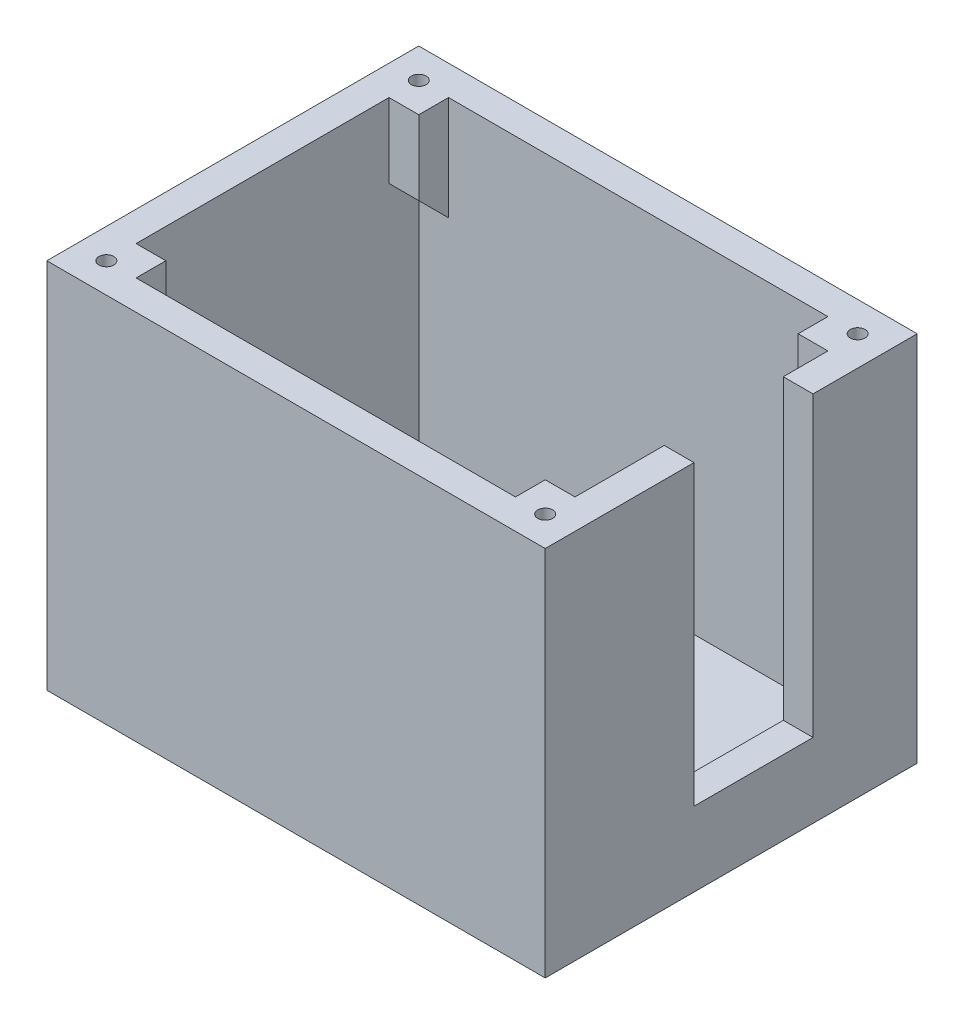
ISO-10303-21;
HEADER;
FILE_DESCRIPTION(('STEP AP214'),'2;1');
FILE_NAME('part.step','',(''),(''),'','','');
FILE_SCHEMA(('AUTOMOTIVE_DESIGN { 1 0 10303 214 1 1 1 1 }'));
ENDSEC;
DATA;
#1=APPLICATION_CONTEXT('core data for automotive mechanical design processes');
#2=APPLICATION_PROTOCOL_DEFINITION('international standard','automotive_design',2000,#1);
#3=PRODUCT_CONTEXT('',#1,'mechanical');
#4=PRODUCT('Part','Part','',(#3));
#5=PRODUCT_RELATED_PRODUCT_CATEGORY('part','',(#4));
#6=PRODUCT_DEFINITION_FORMATION('','',#4);
#7=PRODUCT_DEFINITION_CONTEXT('part definition',#1,'design');
#8=PRODUCT_DEFINITION('design','',#6,#7);
#9=PRODUCT_DEFINITION_SHAPE('','',#8);
#10=(LENGTH_UNIT() NAMED_UNIT(*) SI_UNIT(.MILLI.,.METRE.));
#11=(NAMED_UNIT(*) PLANE_ANGLE_UNIT() SI_UNIT($,.RADIAN.));
#12=(NAMED_UNIT(*) SI_UNIT($,.STERADIAN.) SOLID_ANGLE_UNIT());
#13=UNCERTAINTY_MEASURE_WITH_UNIT(LENGTH_MEASURE(1.E-05),#10,'distance_accuracy_value','');
#14=(GEOMETRIC_REPRESENTATION_CONTEXT(3) GLOBAL_UNCERTAINTY_ASSIGNED_CONTEXT((#13)) GLOBAL_UNIT_ASSIGNED_CONTEXT((#10,
#11,#12)) REPRESENTATION_CONTEXT('',''));
#15=CARTESIAN_POINT('',(0.,0.,0.));
#16=DIRECTION('',(0.,0.,1.));
#17=DIRECTION('',(1.,0.,0.));
#18=AXIS2_PLACEMENT_3D('',#15,#16,#17);
#19=CARTESIAN_POINT('',(-11.5454545454545,2.,0.));
#20=DIRECTION('',(-1.,0.,0.));
#21=DIRECTION('',(0.,0.,1.));
#22=AXIS2_PLACEMENT_3D('',#19,#20,#21);
#23=PLANE('',#22);
#24=DIRECTION('',(0.,0.,-1.));
#25=VECTOR('',#24,1.);
#26=CARTESIAN_POINT('',(-11.5454545454545,0.,0.));
#27=LINE('',#26,#25);
#28=CARTESIAN_POINT('',(-11.5454545454545,0.,6.56060606060606));
#29=VERTEX_POINT('',#28);
#30=CARTESIAN_POINT('',(-11.5454545454545,0.,-18.4393939393939));
#31=VERTEX_POINT('',#30);
#32=EDGE_CURVE('E396',#29,#31,#27,.T.);
#33=ORIENTED_EDGE('',*,*,#32,.F.);
#34=DIRECTION('',(0.,-1.,0.));
#35=VECTOR('',#34,1.);
#36=CARTESIAN_POINT('',(-11.5454545454545,2.,6.56060606060606));
#37=LINE('',#36,#35);
#38=CARTESIAN_POINT('',(-11.5454545454545,25.,6.56060606060606));
#39=VERTEX_POINT('',#38);
#40=EDGE_CURVE('E421',#39,#29,#37,.T.);
#41=ORIENTED_EDGE('',*,*,#40,.F.);
#42=DIRECTION('',(0.,0.,1.));
#43=VECTOR('',#42,1.);
#44=CARTESIAN_POINT('',(-11.5454545454545,25.,6.56060606060606));
#45=LINE('',#44,#43);
#46=CARTESIAN_POINT('',(-11.5454545454545,25.,-18.4393939393939));
#47=VERTEX_POINT('',#46);
#48=EDGE_CURVE('E362',#47,#39,#45,.T.);
#49=ORIENTED_EDGE('',*,*,#48,.F.);
#50=DIRECTION('',(0.,-1.,0.));
#51=VECTOR('',#50,1.);
#52=CARTESIAN_POINT('',(-11.5454545454545,2.,-18.4393939393939));
#53=LINE('',#52,#51);
#54=EDGE_CURVE('E411',#47,#31,#53,.T.);
#55=ORIENTED_EDGE('',*,*,#54,.T.);
#56=EDGE_LOOP('',(#33,#41,#49,#55));
#57=FACE_BOUND('',#56,.T.);
#58=ADVANCED_FACE('F48',(#57),#23,.T.);
#59=CARTESIAN_POINT('',(0.,2.,6.56060606060606));
#60=DIRECTION('',(0.,0.,-1.));
#61=DIRECTION('',(-1.,0.,0.));
#62=AXIS2_PLACEMENT_3D('',#59,#60,#61);
#63=PLANE('',#62);
#64=DIRECTION('',(1.,0.,0.));
#65=VECTOR('',#64,1.);
#66=CARTESIAN_POINT('',(0.,0.,6.56060606060606));
#67=LINE('',#66,#65);
#68=CARTESIAN_POINT('',(21.9545454545455,0.,6.56060606060606));
#69=VERTEX_POINT('',#68);
#70=EDGE_CURVE('E400',#29,#69,#67,.T.);
#71=ORIENTED_EDGE('',*,*,#70,.T.);
#72=DIRECTION('',(0.,-1.,0.));
#73=VECTOR('',#72,1.);
#74=CARTESIAN_POINT('',(21.9545454545455,2.,6.56060606060606));
#75=LINE('',#74,#73);
#76=CARTESIAN_POINT('',(21.9545454545455,25.,6.56060606060606));
#77=VERTEX_POINT('',#76);
#78=EDGE_CURVE('E417',#77,#69,#75,.T.);
#79=ORIENTED_EDGE('',*,*,#78,.F.);
#80=DIRECTION('',(1.,0.,0.));
#81=VECTOR('',#80,1.);
#82=CARTESIAN_POINT('',(-11.5454545454545,25.,6.56060606060606));
#83=LINE('',#82,#81);
#84=EDGE_CURVE('E358',#39,#77,#83,.T.);
#85=ORIENTED_EDGE('',*,*,#84,.F.);
#86=ORIENTED_EDGE('',*,*,#40,.T.);
#87=EDGE_LOOP('',(#71,#79,#85,#86));
#88=FACE_BOUND('',#87,.T.);
#89=ADVANCED_FACE('F482',(#88),#63,.F.);
#90=CARTESIAN_POINT('',(21.9545454545455,2.,0.));
#91=DIRECTION('',(-1.,0.,0.));
#92=DIRECTION('',(0.,0.,1.));
#93=AXIS2_PLACEMENT_3D('',#90,#91,#92);
#94=PLANE('',#93);
#95=DIRECTION('',(0.,0.,-1.));
#96=VECTOR('',#95,1.);
#97=CARTESIAN_POINT('',(21.9545454545455,25.,6.56060606060606));
#98=LINE('',#97,#96);
#99=CARTESIAN_POINT('',(21.9545454545455,25.,-11.4393939393939));
#100=VERTEX_POINT('',#99);
#101=CARTESIAN_POINT('',(21.9545454545455,25.,-18.4393939393939));
#102=VERTEX_POINT('',#101);
#103=EDGE_CURVE('E353',#100,#102,#98,.T.);
#104=ORIENTED_EDGE('',*,*,#103,.F.);
#105=DIRECTION('',(0.,1.,0.));
#106=VECTOR('',#105,1.);
#107=CARTESIAN_POINT('',(21.9545454545455,-6.24621125123532,-11.4393939393939));
#108=LINE('',#107,#106);
#109=CARTESIAN_POINT('',(21.9545454545455,5.,-11.4393939393939));
#110=VERTEX_POINT('',#109);
#111=EDGE_CURVE('E327',#110,#100,#108,.T.);
#112=ORIENTED_EDGE('',*,*,#111,.F.);
#113=DIRECTION('',(0.,0.,1.));
#114=VECTOR('',#113,1.);
#115=CARTESIAN_POINT('',(21.9545454545455,5.,-3.43939393939394));
#116=LINE('',#115,#114);
#117=CARTESIAN_POINT('',(21.9545454545455,5.,-3.43939393939394));
#118=VERTEX_POINT('',#117);
#119=EDGE_CURVE('E305',#110,#118,#116,.T.);
#120=ORIENTED_EDGE('',*,*,#119,.T.);
#121=DIRECTION('',(0.,1.,0.));
#122=VECTOR('',#121,1.);
#123=CARTESIAN_POINT('',(21.9545454545455,-6.24621125123532,-3.43939393939394));
#124=LINE('',#123,#122);
#125=CARTESIAN_POINT('',(21.9545454545455,25.,-3.43939393939394));
#126=VERTEX_POINT('',#125);
#127=EDGE_CURVE('E330',#118,#126,#124,.T.);
#128=ORIENTED_EDGE('',*,*,#127,.T.);
#129=EDGE_CURVE('E354',#77,#126,#98,.T.);
#130=ORIENTED_EDGE('',*,*,#129,.F.);
#131=ORIENTED_EDGE('',*,*,#78,.T.);
#132=DIRECTION('',(0.,0.,-1.));
#133=VECTOR('',#132,1.);
#134=CARTESIAN_POINT('',(21.9545454545455,0.,0.));
#135=LINE('',#134,#133);
#136=CARTESIAN_POINT('',(21.9545454545455,0.,-18.4393939393939));
#137=VERTEX_POINT('',#136);
#138=EDGE_CURVE('E403',#69,#137,#135,.T.);
#139=ORIENTED_EDGE('',*,*,#138,.T.);
#140=DIRECTION('',(0.,-1.,0.));
#141=VECTOR('',#140,1.);
#142=CARTESIAN_POINT('',(21.9545454545455,2.,-18.4393939393939));
#143=LINE('',#142,#141);
#144=EDGE_CURVE('E414',#102,#137,#143,.T.);
#145=ORIENTED_EDGE('',*,*,#144,.F.);
#146=EDGE_LOOP('',(#104,#112,#120,#128,#130,#131,#139,#145));
#147=FACE_BOUND('',#146,.T.);
#148=ADVANCED_FACE('F470',(#147),#94,.F.);
#149=CARTESIAN_POINT('',(0.,2.,-18.4393939393939));
#150=DIRECTION('',(0.,0.,-1.));
#151=DIRECTION('',(-1.,0.,0.));
#152=AXIS2_PLACEMENT_3D('',#149,#150,#151);
#153=PLANE('',#152);
#154=DIRECTION('',(1.,0.,0.));
#155=VECTOR('',#154,1.);
#156=CARTESIAN_POINT('',(0.,0.,-18.4393939393939));
#157=LINE('',#156,#155);
#158=EDGE_CURVE('E407',#31,#137,#157,.T.);
#159=ORIENTED_EDGE('',*,*,#158,.F.);
#160=ORIENTED_EDGE('',*,*,#54,.F.);
#161=DIRECTION('',(-1.,0.,0.));
#162=VECTOR('',#161,1.);
#163=CARTESIAN_POINT('',(-11.5454545454545,25.,-18.4393939393939));
#164=LINE('',#163,#162);
#165=EDGE_CURVE('E349',#102,#47,#164,.T.);
#166=ORIENTED_EDGE('',*,*,#165,.F.);
#167=ORIENTED_EDGE('',*,*,#144,.T.);
#168=EDGE_LOOP('',(#159,#160,#166,#167));
#169=FACE_BOUND('',#168,.T.);
#170=ADVANCED_FACE('F475',(#169),#153,.T.);
#171=CARTESIAN_POINT('',(0.,0.,0.));
#172=DIRECTION('',(0.,1.,0.));
#173=DIRECTION('',(0.,0.,1.));
#174=AXIS2_PLACEMENT_3D('',#171,#172,#173);
#175=PLANE('',#174);
#176=ORIENTED_EDGE('',*,*,#32,.T.);
#177=ORIENTED_EDGE('',*,*,#158,.T.);
#178=ORIENTED_EDGE('',*,*,#138,.F.);
#179=ORIENTED_EDGE('',*,*,#70,.F.);
#180=EDGE_LOOP('',(#176,#177,#178,#179));
#181=FACE_BOUND('',#180,.T.);
#182=ADVANCED_FACE('F601',(#181),#175,.F.);
#183=CARTESIAN_POINT('',(-9.54545454545454,89.8001196170537,-16.4393939393939));
#184=DIRECTION('',(0.,0.,1.));
#185=DIRECTION('',(1.,0.,0.));
#186=AXIS2_PLACEMENT_3D('',#183,#184,#185);
#187=PLANE('',#186);
#188=DIRECTION('',(0.,-1.,0.));
#189=VECTOR('',#188,1.);
#190=CARTESIAN_POINT('',(19.9545454545455,89.8001196170537,-16.4393939393939));
#191=LINE('',#190,#189);
#192=CARTESIAN_POINT('',(19.9545454545455,18.,-16.4393939393939));
#193=VERTEX_POINT('',#192);
#194=CARTESIAN_POINT('',(19.9545454545455,2.,-16.4393939393939));
#195=VERTEX_POINT('',#194);
#196=EDGE_CURVE('E369',#193,#195,#191,.T.);
#197=ORIENTED_EDGE('',*,*,#196,.F.);
#198=DIRECTION('',(-1.,0.,0.));
#199=VECTOR('',#198,1.);
#200=CARTESIAN_POINT('',(17.9545454545455,18.,-16.4393939393939));
#201=LINE('',#200,#199);
#202=CARTESIAN_POINT('',(17.9545454545455,18.,-16.4393939393939));
#203=VERTEX_POINT('',#202);
#204=EDGE_CURVE('E447',#193,#203,#201,.T.);
#205=ORIENTED_EDGE('',*,*,#204,.T.);
#206=DIRECTION('',(0.,1.,0.));
#207=VECTOR('',#206,1.);
#208=CARTESIAN_POINT('',(17.9545454545455,20.,-16.4393939393939));
#209=LINE('',#208,#207);
#210=CARTESIAN_POINT('',(17.9545454545455,25.,-16.4393939393939));
#211=VERTEX_POINT('',#210);
#212=EDGE_CURVE('E65',#203,#211,#209,.T.);
#213=ORIENTED_EDGE('',*,*,#212,.T.);
#214=DIRECTION('',(-1.,0.,0.));
#215=VECTOR('',#214,1.);
#216=CARTESIAN_POINT('',(-9.54545454545454,25.,-16.4393939393939));
#217=LINE('',#216,#215);
#218=CARTESIAN_POINT('',(-7.54545454545454,25.,-16.4393939393939));
#219=VERTEX_POINT('',#218);
#220=EDGE_CURVE('E228',#211,#219,#217,.T.);
#221=ORIENTED_EDGE('',*,*,#220,.T.);
#222=DIRECTION('',(0.,1.,0.));
#223=VECTOR('',#222,1.);
#224=CARTESIAN_POINT('',(-7.54545454545454,20.,-16.4393939393939));
#225=LINE('',#224,#223);
#226=CARTESIAN_POINT('',(-7.54545454545454,18.,-16.4393939393939));
#227=VERTEX_POINT('',#226);
#228=EDGE_CURVE('E73',#227,#219,#225,.T.);
#229=ORIENTED_EDGE('',*,*,#228,.F.);
#230=DIRECTION('',(-1.,0.,0.));
#231=VECTOR('',#230,1.);
#232=CARTESIAN_POINT('',(-9.54545454545454,18.,-16.4393939393939));
#233=LINE('',#232,#231);
#234=CARTESIAN_POINT('',(-9.54545454545454,18.,-16.4393939393939));
#235=VERTEX_POINT('',#234);
#236=EDGE_CURVE('E444',#227,#235,#233,.T.);
#237=ORIENTED_EDGE('',*,*,#236,.T.);
#238=DIRECTION('',(0.,-1.,0.));
#239=VECTOR('',#238,1.);
#240=CARTESIAN_POINT('',(-9.54545454545454,89.8001196170537,-16.4393939393939));
#241=LINE('',#240,#239);
#242=CARTESIAN_POINT('',(-9.54545454545454,2.00000000000003,-16.4393939393939));
#243=VERTEX_POINT('',#242);
#244=EDGE_CURVE('E366',#235,#243,#241,.T.);
#245=ORIENTED_EDGE('',*,*,#244,.T.);
#246=DIRECTION('',(1.,0.,0.));
#247=VECTOR('',#246,1.);
#248=CARTESIAN_POINT('',(0.,2.,-16.4393939393939));
#249=LINE('',#248,#247);
#250=EDGE_CURVE('E392',#243,#195,#249,.T.);
#251=ORIENTED_EDGE('',*,*,#250,.T.);
#252=EDGE_LOOP('',(#197,#205,#213,#221,#229,#237,#245,#251));
#253=FACE_BOUND('',#252,.T.);
#254=ADVANCED_FACE('F529',(#253),#187,.T.);
#255=CARTESIAN_POINT('',(19.9545454545455,89.8001196170537,4.56060606060606));
#256=DIRECTION('',(-1.,0.,0.));
#257=DIRECTION('',(0.,0.,1.));
#258=AXIS2_PLACEMENT_3D('',#255,#256,#257);
#259=PLANE('',#258);
#260=DIRECTION('',(0.,-1.,0.));
#261=VECTOR('',#260,1.);
#262=CARTESIAN_POINT('',(19.9545454545455,89.8001196170537,4.56060606060606));
#263=LINE('',#262,#261);
#264=CARTESIAN_POINT('',(19.9545454545455,18.,4.56060606060606));
#265=VERTEX_POINT('',#264);
#266=CARTESIAN_POINT('',(19.9545454545455,2.,4.56060606060606));
#267=VERTEX_POINT('',#266);
#268=EDGE_CURVE('E372',#265,#267,#263,.T.);
#269=ORIENTED_EDGE('',*,*,#268,.F.);
#270=DIRECTION('',(0.,0.707106781186552,-0.707106781186543));
#271=VECTOR('',#270,1.);
#272=CARTESIAN_POINT('',(19.9545454545455,53.9000598085273,-31.3394537479208));
#273=LINE('',#272,#271);
#274=CARTESIAN_POINT('',(19.9545454545455,20.,2.56060606060606));
#275=VERTEX_POINT('',#274);
#276=EDGE_CURVE('E435',#265,#275,#273,.T.);
#277=ORIENTED_EDGE('',*,*,#276,.T.);
#278=DIRECTION('',(0.,1.,0.));
#279=VECTOR('',#278,1.);
#280=CARTESIAN_POINT('',(19.9545454545455,20.,2.56060606060606));
#281=LINE('',#280,#279);
#282=CARTESIAN_POINT('',(19.9545454545455,25.,2.56060606060606));
#283=VERTEX_POINT('',#282);
#284=EDGE_CURVE('E241',#275,#283,#281,.T.);
#285=ORIENTED_EDGE('',*,*,#284,.T.);
#286=DIRECTION('',(0.,0.,-1.));
#287=VECTOR('',#286,1.);
#288=CARTESIAN_POINT('',(19.9545454545455,25.,4.56060606060606));
#289=LINE('',#288,#287);
#290=CARTESIAN_POINT('',(19.9545454545455,25.,-3.43939393939394));
#291=VERTEX_POINT('',#290);
#292=EDGE_CURVE('E340',#283,#291,#289,.T.);
#293=ORIENTED_EDGE('',*,*,#292,.T.);
#294=DIRECTION('',(0.,1.,0.));
#295=VECTOR('',#294,1.);
#296=CARTESIAN_POINT('',(19.9545454545455,-6.24621125123532,-3.43939393939394));
#297=LINE('',#296,#295);
#298=CARTESIAN_POINT('',(19.9545454545455,5.,-3.43939393939394));
#299=VERTEX_POINT('',#298);
#300=EDGE_CURVE('E323',#299,#291,#297,.T.);
#301=ORIENTED_EDGE('',*,*,#300,.F.);
#302=DIRECTION('',(0.,0.,-1.));
#303=VECTOR('',#302,1.);
#304=CARTESIAN_POINT('',(19.9545454545455,5.,-3.43939393939394));
#305=LINE('',#304,#303);
#306=CARTESIAN_POINT('',(19.9545454545455,5.,-11.4393939393939));
#307=VERTEX_POINT('',#306);
#308=EDGE_CURVE('E313',#299,#307,#305,.T.);
#309=ORIENTED_EDGE('',*,*,#308,.T.);
#310=DIRECTION('',(0.,1.,0.));
#311=VECTOR('',#310,1.);
#312=CARTESIAN_POINT('',(19.9545454545455,-6.24621125123532,-11.4393939393939));
#313=LINE('',#312,#311);
#314=CARTESIAN_POINT('',(19.9545454545455,25.,-11.4393939393939));
#315=VERTEX_POINT('',#314);
#316=EDGE_CURVE('E310',#307,#315,#313,.T.);
#317=ORIENTED_EDGE('',*,*,#316,.T.);
#318=CARTESIAN_POINT('',(19.9545454545455,25.,-14.4393939393939));
#319=VERTEX_POINT('',#318);
#320=EDGE_CURVE('E339',#315,#319,#289,.T.);
#321=ORIENTED_EDGE('',*,*,#320,.T.);
#322=DIRECTION('',(0.,1.,0.));
#323=VECTOR('',#322,1.);
#324=CARTESIAN_POINT('',(19.9545454545455,20.,-14.4393939393939));
#325=LINE('',#324,#323);
#326=CARTESIAN_POINT('',(19.9545454545455,20.,-14.4393939393939));
#327=VERTEX_POINT('',#326);
#328=EDGE_CURVE('E219',#327,#319,#325,.T.);
#329=ORIENTED_EDGE('',*,*,#328,.F.);
#330=DIRECTION('',(0.,0.707106781186552,0.707106781186543));
#331=VECTOR('',#330,1.);
#332=CARTESIAN_POINT('',(19.9545454545455,64.4000598085273,29.9606658691328));
#333=LINE('',#332,#331);
#334=EDGE_CURVE('E432',#327,#193,#333,.F.);
#335=ORIENTED_EDGE('',*,*,#334,.T.);
#336=ORIENTED_EDGE('',*,*,#196,.T.);
#337=DIRECTION('',(0.,0.,1.));
#338=VECTOR('',#337,1.);
#339=CARTESIAN_POINT('',(19.9545454545455,2.,0.));
#340=LINE('',#339,#338);
#341=EDGE_CURVE('E388',#195,#267,#340,.T.);
#342=ORIENTED_EDGE('',*,*,#341,.T.);
#343=EDGE_LOOP('',(#269,#277,#285,#293,#301,#309,#317,#321,#329,#335,#336,#342));
#344=FACE_BOUND('',#343,.T.);
#345=ADVANCED_FACE('F462',(#344),#259,.T.);
#346=CARTESIAN_POINT('',(-9.54545454545454,89.8001196170537,4.56060606060606));
#347=DIRECTION('',(0.,0.,-1.));
#348=DIRECTION('',(-1.,0.,0.));
#349=AXIS2_PLACEMENT_3D('',#346,#347,#348);
#350=PLANE('',#349);
#351=DIRECTION('',(0.,1.,0.));
#352=VECTOR('',#351,1.);
#353=CARTESIAN_POINT('',(17.9545454545455,20.,4.56060606060606));
#354=LINE('',#353,#352);
#355=CARTESIAN_POINT('',(17.9545454545455,18.,4.56060606060606));
#356=VERTEX_POINT('',#355);
#357=CARTESIAN_POINT('',(17.9545454545455,25.,4.56060606060606));
#358=VERTEX_POINT('',#357);
#359=EDGE_CURVE('E230',#356,#358,#354,.T.);
#360=ORIENTED_EDGE('',*,*,#359,.F.);
#361=DIRECTION('',(1.,0.,0.));
#362=VECTOR('',#361,1.);
#363=CARTESIAN_POINT('',(-9.54545454545454,18.,4.56060606060606));
#364=LINE('',#363,#362);
#365=EDGE_CURVE('E428',#356,#265,#364,.T.);
#366=ORIENTED_EDGE('',*,*,#365,.T.);
#367=ORIENTED_EDGE('',*,*,#268,.T.);
#368=DIRECTION('',(-1.,0.,0.));
#369=VECTOR('',#368,1.);
#370=CARTESIAN_POINT('',(0.,2.,4.56060606060606));
#371=LINE('',#370,#369);
#372=CARTESIAN_POINT('',(-9.54545454545454,2.,4.56060606060606));
#373=VERTEX_POINT('',#372);
#374=EDGE_CURVE('E384',#267,#373,#371,.T.);
#375=ORIENTED_EDGE('',*,*,#374,.T.);
#376=DIRECTION('',(0.,-1.,0.));
#377=VECTOR('',#376,1.);
#378=CARTESIAN_POINT('',(-9.54545454545454,89.8001196170537,4.56060606060606));
#379=LINE('',#378,#377);
#380=CARTESIAN_POINT('',(-9.54545454545454,18.,4.56060606060606));
#381=VERTEX_POINT('',#380);
#382=EDGE_CURVE('E375',#381,#373,#379,.T.);
#383=ORIENTED_EDGE('',*,*,#382,.F.);
#384=DIRECTION('',(1.,0.,0.));
#385=VECTOR('',#384,1.);
#386=CARTESIAN_POINT('',(-7.54545454545454,18.,4.56060606060606));
#387=LINE('',#386,#385);
#388=CARTESIAN_POINT('',(-7.54545454545454,18.,4.56060606060606));
#389=VERTEX_POINT('',#388);
#390=EDGE_CURVE('E424',#381,#389,#387,.T.);
#391=ORIENTED_EDGE('',*,*,#390,.T.);
#392=DIRECTION('',(0.,1.,0.));
#393=VECTOR('',#392,1.);
#394=CARTESIAN_POINT('',(-7.54545454545454,20.,4.56060606060606));
#395=LINE('',#394,#393);
#396=CARTESIAN_POINT('',(-7.54545454545454,25.,4.56060606060606));
#397=VERTEX_POINT('',#396);
#398=EDGE_CURVE('E263',#389,#397,#395,.T.);
#399=ORIENTED_EDGE('',*,*,#398,.T.);
#400=DIRECTION('',(1.,0.,0.));
#401=VECTOR('',#400,1.);
#402=CARTESIAN_POINT('',(-9.54545454545454,25.,4.56060606060606));
#403=LINE('',#402,#401);
#404=EDGE_CURVE('E343',#397,#358,#403,.T.);
#405=ORIENTED_EDGE('',*,*,#404,.T.);
#406=EDGE_LOOP('',(#360,#366,#367,#375,#383,#391,#399,#405));
#407=FACE_BOUND('',#406,.T.);
#408=ADVANCED_FACE('F505',(#407),#350,.T.);
#409=CARTESIAN_POINT('',(-9.54545454545454,89.8001196170537,4.56060606060606));
#410=DIRECTION('',(1.,0.,0.));
#411=DIRECTION('',(0.,0.,-1.));
#412=AXIS2_PLACEMENT_3D('',#409,#410,#411);
#413=PLANE('',#412);
#414=DIRECTION('',(0.,1.,0.));
#415=VECTOR('',#414,1.);
#416=CARTESIAN_POINT('',(-9.54545454545454,20.,2.56060606060606));
#417=LINE('',#416,#415);
#418=CARTESIAN_POINT('',(-9.54545454545454,20.,2.56060606060606));
#419=VERTEX_POINT('',#418);
#420=CARTESIAN_POINT('',(-9.54545454545454,25.,2.56060606060606));
#421=VERTEX_POINT('',#420);
#422=EDGE_CURVE('E259',#419,#421,#417,.T.);
#423=ORIENTED_EDGE('',*,*,#422,.F.);
#424=DIRECTION('',(0.,0.707106781186552,-0.707106781186543));
#425=VECTOR('',#424,1.);
#426=CARTESIAN_POINT('',(-9.54545454545454,53.9000598085273,-31.3394537479208));
#427=LINE('',#426,#425);
#428=EDGE_CURVE('E441',#419,#381,#427,.F.);
#429=ORIENTED_EDGE('',*,*,#428,.T.);
#430=ORIENTED_EDGE('',*,*,#382,.T.);
#431=DIRECTION('',(0.,0.,-1.));
#432=VECTOR('',#431,1.);
#433=CARTESIAN_POINT('',(-9.54545454545454,2.,0.));
#434=LINE('',#433,#432);
#435=EDGE_CURVE('E380',#373,#243,#434,.T.);
#436=ORIENTED_EDGE('',*,*,#435,.T.);
#437=ORIENTED_EDGE('',*,*,#244,.F.);
#438=DIRECTION('',(0.,0.707106781186552,0.707106781186543));
#439=VECTOR('',#438,1.);
#440=CARTESIAN_POINT('',(-9.54545454545454,64.4000598085273,29.9606658691328));
#441=LINE('',#440,#439);
#442=CARTESIAN_POINT('',(-9.54545454545454,20.,-14.4393939393939));
#443=VERTEX_POINT('',#442);
#444=EDGE_CURVE('E438',#235,#443,#441,.T.);
#445=ORIENTED_EDGE('',*,*,#444,.T.);
#446=DIRECTION('',(0.,1.,0.));
#447=VECTOR('',#446,1.);
#448=CARTESIAN_POINT('',(-9.54545454545454,20.,-14.4393939393939));
#449=LINE('',#448,#447);
#450=CARTESIAN_POINT('',(-9.54545454545454,25.,-14.4393939393939));
#451=VERTEX_POINT('',#450);
#452=EDGE_CURVE('E290',#443,#451,#449,.T.);
#453=ORIENTED_EDGE('',*,*,#452,.T.);
#454=DIRECTION('',(0.,0.,1.));
#455=VECTOR('',#454,1.);
#456=CARTESIAN_POINT('',(-9.54545454545454,25.,4.56060606060606));
#457=LINE('',#456,#455);
#458=EDGE_CURVE('E346',#451,#421,#457,.T.);
#459=ORIENTED_EDGE('',*,*,#458,.T.);
#460=EDGE_LOOP('',(#423,#429,#430,#436,#437,#445,#453,#459));
#461=FACE_BOUND('',#460,.T.);
#462=ADVANCED_FACE('F519',(#461),#413,.T.);
#463=CARTESIAN_POINT('',(0.,25.,0.));
#464=DIRECTION('',(0.,1.,0.));
#465=DIRECTION('',(0.,0.,1.));
#466=AXIS2_PLACEMENT_3D('',#463,#464,#465);
#467=PLANE('',#466);
#468=CARTESIAN_POINT('',(-9.54545454545454,25.,4.56060606060606));
#469=DIRECTION('',(0.,1.,0.));
#470=DIRECTION('',(0.,0.,1.));
#471=AXIS2_PLACEMENT_3D('',#468,#469,#470);
#472=CIRCLE('',#471,0.500000000000001);
#473=CARTESIAN_POINT('',(-9.54545454545454,25.,5.06060606060606));
#474=VERTEX_POINT('',#473);
#475=EDGE_CURVE('E949',#474,#474,#472,.T.);
#476=ORIENTED_EDGE('',*,*,#475,.F.);
#477=EDGE_LOOP('',(#476));
#478=FACE_BOUND('',#477,.T.);
#479=CARTESIAN_POINT('',(-9.54545454545454,25.,-16.4393939393939));
#480=DIRECTION('',(0.,1.,0.));
#481=DIRECTION('',(0.,0.,1.));
#482=AXIS2_PLACEMENT_3D('',#479,#480,#481);
#483=CIRCLE('',#482,0.500000000000001);
#484=CARTESIAN_POINT('',(-9.54545454545454,25.,-15.9393939393939));
#485=VERTEX_POINT('',#484);
#486=EDGE_CURVE('E948',#485,#485,#483,.T.);
#487=ORIENTED_EDGE('',*,*,#486,.F.);
#488=EDGE_LOOP('',(#487));
#489=FACE_BOUND('',#488,.T.);
#490=CARTESIAN_POINT('',(19.9545454545455,25.,-16.4393939393939));
#491=DIRECTION('',(0.,1.,0.));
#492=DIRECTION('',(0.,0.,1.));
#493=AXIS2_PLACEMENT_3D('',#490,#491,#492);
#494=CIRCLE('',#493,0.499999999999999);
#495=CARTESIAN_POINT('',(19.9545454545455,25.,-15.9393939393939));
#496=VERTEX_POINT('',#495);
#497=EDGE_CURVE('E982',#496,#496,#494,.T.);
#498=ORIENTED_EDGE('',*,*,#497,.F.);
#499=EDGE_LOOP('',(#498));
#500=FACE_BOUND('',#499,.T.);
#501=CARTESIAN_POINT('',(19.9545454545455,25.,4.56060606060606));
#502=DIRECTION('',(0.,1.,0.));
#503=DIRECTION('',(0.,0.,1.));
#504=AXIS2_PLACEMENT_3D('',#501,#502,#503);
#505=CIRCLE('',#504,0.499999999999999);
#506=CARTESIAN_POINT('',(19.9545454545455,25.,5.06060606060606));
#507=VERTEX_POINT('',#506);
#508=EDGE_CURVE('E964',#507,#507,#505,.T.);
#509=ORIENTED_EDGE('',*,*,#508,.F.);
#510=EDGE_LOOP('',(#509));
#511=FACE_BOUND('',#510,.T.);
#512=ORIENTED_EDGE('',*,*,#292,.F.);
#513=DIRECTION('',(-1.,0.,0.));
#514=VECTOR('',#513,1.);
#515=CARTESIAN_POINT('',(19.9545454545455,25.,2.56060606060606));
#516=LINE('',#515,#514);
#517=CARTESIAN_POINT('',(17.9545454545455,25.,2.56060606060606));
#518=VERTEX_POINT('',#517);
#519=EDGE_CURVE('E255',#283,#518,#516,.T.);
#520=ORIENTED_EDGE('',*,*,#519,.T.);
#521=DIRECTION('',(0.,0.,1.));
#522=VECTOR('',#521,1.);
#523=CARTESIAN_POINT('',(17.9545454545455,25.,4.56060606060606));
#524=LINE('',#523,#522);
#525=EDGE_CURVE('E251',#518,#358,#524,.T.);
#526=ORIENTED_EDGE('',*,*,#525,.T.);
#527=ORIENTED_EDGE('',*,*,#404,.F.);
#528=DIRECTION('',(0.,0.,-1.));
#529=VECTOR('',#528,1.);
#530=CARTESIAN_POINT('',(-7.54545454545454,25.,4.56060606060606));
#531=LINE('',#530,#529);
#532=CARTESIAN_POINT('',(-7.54545454545454,25.,2.56060606060606));
#533=VERTEX_POINT('',#532);
#534=EDGE_CURVE('E278',#397,#533,#531,.T.);
#535=ORIENTED_EDGE('',*,*,#534,.T.);
#536=DIRECTION('',(-1.,0.,0.));
#537=VECTOR('',#536,1.);
#538=CARTESIAN_POINT('',(-9.54545454545454,25.,2.56060606060606));
#539=LINE('',#538,#537);
#540=EDGE_CURVE('E274',#533,#421,#539,.T.);
#541=ORIENTED_EDGE('',*,*,#540,.T.);
#542=ORIENTED_EDGE('',*,*,#458,.F.);
#543=DIRECTION('',(1.,0.,0.));
#544=VECTOR('',#543,1.);
#545=CARTESIAN_POINT('',(-9.54545454545454,25.,-14.4393939393939));
#546=LINE('',#545,#544);
#547=CARTESIAN_POINT('',(-7.54545454545454,25.,-14.4393939393939));
#548=VERTEX_POINT('',#547);
#549=EDGE_CURVE('E282',#451,#548,#546,.T.);
#550=ORIENTED_EDGE('',*,*,#549,.T.);
#551=DIRECTION('',(0.,0.,-1.));
#552=VECTOR('',#551,1.);
#553=CARTESIAN_POINT('',(-7.54545454545454,25.,-16.4393939393939));
#554=LINE('',#553,#552);
#555=EDGE_CURVE('E291',#548,#219,#554,.T.);
#556=ORIENTED_EDGE('',*,*,#555,.T.);
#557=ORIENTED_EDGE('',*,*,#220,.F.);
#558=DIRECTION('',(0.,0.,1.));
#559=VECTOR('',#558,1.);
#560=CARTESIAN_POINT('',(17.9545454545455,25.,-16.4393939393939));
#561=LINE('',#560,#559);
#562=CARTESIAN_POINT('',(17.9545454545455,25.,-14.4393939393939));
#563=VERTEX_POINT('',#562);
#564=EDGE_CURVE('E213',#211,#563,#561,.T.);
#565=ORIENTED_EDGE('',*,*,#564,.T.);
#566=DIRECTION('',(1.,0.,0.));
#567=VECTOR('',#566,1.);
#568=CARTESIAN_POINT('',(19.9545454545455,25.,-14.4393939393939));
#569=LINE('',#568,#567);
#570=EDGE_CURVE('E226',#563,#319,#569,.T.);
#571=ORIENTED_EDGE('',*,*,#570,.T.);
#572=ORIENTED_EDGE('',*,*,#320,.F.);
#573=DIRECTION('',(-1.,0.,0.));
#574=VECTOR('',#573,1.);
#575=CARTESIAN_POINT('',(19.9545454545455,25.,-11.4393939393939));
#576=LINE('',#575,#574);
#577=EDGE_CURVE('E320',#100,#315,#576,.T.);
#578=ORIENTED_EDGE('',*,*,#577,.F.);
#579=ORIENTED_EDGE('',*,*,#103,.T.);
#580=ORIENTED_EDGE('',*,*,#165,.T.);
#581=ORIENTED_EDGE('',*,*,#48,.T.);
#582=ORIENTED_EDGE('',*,*,#84,.T.);
#583=ORIENTED_EDGE('',*,*,#129,.T.);
#584=DIRECTION('',(1.,0.,0.));
#585=VECTOR('',#584,1.);
#586=CARTESIAN_POINT('',(19.9545454545455,25.,-3.43939393939394));
#587=LINE('',#586,#585);
#588=EDGE_CURVE('E299',#291,#126,#587,.T.);
#589=ORIENTED_EDGE('',*,*,#588,.F.);
#590=EDGE_LOOP('',(#512,#520,#526,#527,#535,#541,#542,#550,#556,#557,#565,#571,#572,#578,#579,
#580,#581,#582,#583,#589));
#591=FACE_BOUND('',#590,.T.);
#592=ADVANCED_FACE('F224',(#478,#489,#500,#511,#591),#467,.T.);
#593=CARTESIAN_POINT('',(0.,2.,0.));
#594=DIRECTION('',(0.,1.,0.));
#595=DIRECTION('',(0.,0.,1.));
#596=AXIS2_PLACEMENT_3D('',#593,#594,#595);
#597=PLANE('',#596);
#598=ORIENTED_EDGE('',*,*,#250,.F.);
#599=ORIENTED_EDGE('',*,*,#435,.F.);
#600=ORIENTED_EDGE('',*,*,#374,.F.);
#601=ORIENTED_EDGE('',*,*,#341,.F.);
#602=EDGE_LOOP('',(#598,#599,#600,#601));
#603=FACE_BOUND('',#602,.T.);
#604=ADVANCED_FACE('F525',(#603),#597,.T.);
#605=CARTESIAN_POINT('',(19.9545454545455,-6.24621125123532,-11.4393939393939));
#606=DIRECTION('',(0.,0.,-1.));
#607=DIRECTION('',(-1.,0.,0.));
#608=AXIS2_PLACEMENT_3D('',#605,#606,#607);
#609=PLANE('',#608);
#610=DIRECTION('',(1.,0.,0.));
#611=VECTOR('',#610,1.);
#612=CARTESIAN_POINT('',(19.9545454545455,5.,-11.4393939393939));
#613=LINE('',#612,#611);
#614=EDGE_CURVE('E309',#307,#110,#613,.T.);
#615=ORIENTED_EDGE('',*,*,#614,.T.);
#616=ORIENTED_EDGE('',*,*,#111,.T.);
#617=ORIENTED_EDGE('',*,*,#577,.T.);
#618=ORIENTED_EDGE('',*,*,#316,.F.);
#619=EDGE_LOOP('',(#615,#616,#617,#618));
#620=FACE_BOUND('',#619,.T.);
#621=ADVANCED_FACE('F591',(#620),#609,.F.);
#622=CARTESIAN_POINT('',(19.9545454545455,-6.24621125123532,-3.43939393939394));
#623=DIRECTION('',(0.,0.,1.));
#624=DIRECTION('',(1.,0.,0.));
#625=AXIS2_PLACEMENT_3D('',#622,#623,#624);
#626=PLANE('',#625);
#627=DIRECTION('',(-1.,0.,0.));
#628=VECTOR('',#627,1.);
#629=CARTESIAN_POINT('',(19.9545454545455,5.,-3.43939393939394));
#630=LINE('',#629,#628);
#631=EDGE_CURVE('E317',#118,#299,#630,.T.);
#632=ORIENTED_EDGE('',*,*,#631,.T.);
#633=ORIENTED_EDGE('',*,*,#300,.T.);
#634=ORIENTED_EDGE('',*,*,#588,.T.);
#635=ORIENTED_EDGE('',*,*,#127,.F.);
#636=EDGE_LOOP('',(#632,#633,#634,#635));
#637=FACE_BOUND('',#636,.T.);
#638=ADVANCED_FACE('F487',(#637),#626,.F.);
#639=CARTESIAN_POINT('',(0.,5.,0.));
#640=DIRECTION('',(0.,1.,0.));
#641=DIRECTION('',(0.,0.,1.));
#642=AXIS2_PLACEMENT_3D('',#639,#640,#641);
#643=PLANE('',#642);
#644=ORIENTED_EDGE('',*,*,#308,.F.);
#645=ORIENTED_EDGE('',*,*,#631,.F.);
#646=ORIENTED_EDGE('',*,*,#119,.F.);
#647=ORIENTED_EDGE('',*,*,#614,.F.);
#648=EDGE_LOOP('',(#644,#645,#646,#647));
#649=FACE_BOUND('',#648,.T.);
#650=ADVANCED_FACE('F583',(#649),#643,.T.);
#651=CARTESIAN_POINT('',(-7.54545454545454,20.,-16.4393939393939));
#652=DIRECTION('',(1.,0.,0.));
#653=DIRECTION('',(0.,0.,-1.));
#654=AXIS2_PLACEMENT_3D('',#651,#652,#653);
#655=PLANE('',#654);
#656=ORIENTED_EDGE('',*,*,#555,.F.);
#657=DIRECTION('',(0.,1.,0.));
#658=VECTOR('',#657,1.);
#659=CARTESIAN_POINT('',(-7.54545454545454,20.,-14.4393939393939));
#660=LINE('',#659,#658);
#661=CARTESIAN_POINT('',(-7.54545454545454,20.,-14.4393939393939));
#662=VERTEX_POINT('',#661);
#663=EDGE_CURVE('E300',#662,#548,#660,.T.);
#664=ORIENTED_EDGE('',*,*,#663,.F.);
#665=DIRECTION('',(0.,-0.707106781186552,-0.707106781186543));
#666=VECTOR('',#665,1.);
#667=CARTESIAN_POINT('',(-7.54545454545454,18.,-16.4393939393939));
#668=LINE('',#667,#666);
#669=EDGE_CURVE('E13',#662,#227,#668,.T.);
#670=ORIENTED_EDGE('',*,*,#669,.T.);
#671=ORIENTED_EDGE('',*,*,#228,.T.);
#672=EDGE_LOOP('',(#656,#664,#670,#671));
#673=FACE_BOUND('',#672,.T.);
#674=ADVANCED_FACE('F580',(#673),#655,.T.);
#675=CARTESIAN_POINT('',(-9.54545454545454,20.,-14.4393939393939));
#676=DIRECTION('',(0.,0.,1.));
#677=DIRECTION('',(1.,0.,0.));
#678=AXIS2_PLACEMENT_3D('',#675,#676,#677);
#679=PLANE('',#678);
#680=ORIENTED_EDGE('',*,*,#549,.F.);
#681=ORIENTED_EDGE('',*,*,#452,.F.);
#682=DIRECTION('',(1.,0.,0.));
#683=VECTOR('',#682,1.);
#684=CARTESIAN_POINT('',(-9.54545454545454,20.,-14.4393939393939));
#685=LINE('',#684,#683);
#686=EDGE_CURVE('E286',#443,#662,#685,.T.);
#687=ORIENTED_EDGE('',*,*,#686,.T.);
#688=ORIENTED_EDGE('',*,*,#663,.T.);
#689=EDGE_LOOP('',(#680,#681,#687,#688));
#690=FACE_BOUND('',#689,.T.);
#691=ADVANCED_FACE('F579',(#690),#679,.T.);
#692=CARTESIAN_POINT('',(-9.54545454545454,20.,2.56060606060606));
#693=DIRECTION('',(0.,0.,-1.));
#694=DIRECTION('',(-1.,0.,0.));
#695=AXIS2_PLACEMENT_3D('',#692,#693,#694);
#696=PLANE('',#695);
#697=ORIENTED_EDGE('',*,*,#540,.F.);
#698=DIRECTION('',(0.,1.,0.));
#699=VECTOR('',#698,1.);
#700=CARTESIAN_POINT('',(-7.54545454545454,20.,2.56060606060606));
#701=LINE('',#700,#699);
#702=CARTESIAN_POINT('',(-7.54545454545454,20.,2.56060606060606));
#703=VERTEX_POINT('',#702);
#704=EDGE_CURVE('E268',#703,#533,#701,.T.);
#705=ORIENTED_EDGE('',*,*,#704,.F.);
#706=DIRECTION('',(-1.,0.,0.));
#707=VECTOR('',#706,1.);
#708=CARTESIAN_POINT('',(-9.54545454545454,20.,2.56060606060606));
#709=LINE('',#708,#707);
#710=EDGE_CURVE('E267',#703,#419,#709,.T.);
#711=ORIENTED_EDGE('',*,*,#710,.T.);
#712=ORIENTED_EDGE('',*,*,#422,.T.);
#713=EDGE_LOOP('',(#697,#705,#711,#712));
#714=FACE_BOUND('',#713,.T.);
#715=ADVANCED_FACE('F514',(#714),#696,.T.);
#716=CARTESIAN_POINT('',(-7.54545454545454,20.,4.56060606060606));
#717=DIRECTION('',(1.,0.,0.));
#718=DIRECTION('',(0.,0.,-1.));
#719=AXIS2_PLACEMENT_3D('',#716,#717,#718);
#720=PLANE('',#719);
#721=ORIENTED_EDGE('',*,*,#534,.F.);
#722=ORIENTED_EDGE('',*,*,#398,.F.);
#723=DIRECTION('',(0.,-0.707106781186552,0.707106781186543));
#724=VECTOR('',#723,1.);
#725=CARTESIAN_POINT('',(-7.54545454545454,18.,4.56060606060606));
#726=LINE('',#725,#724);
#727=EDGE_CURVE('E455',#389,#703,#726,.F.);
#728=ORIENTED_EDGE('',*,*,#727,.T.);
#729=ORIENTED_EDGE('',*,*,#704,.T.);
#730=EDGE_LOOP('',(#721,#722,#728,#729));
#731=FACE_BOUND('',#730,.T.);
#732=ADVANCED_FACE('F510',(#731),#720,.T.);
#733=CARTESIAN_POINT('',(17.9545454545455,20.,4.56060606060606));
#734=DIRECTION('',(-1.,0.,0.));
#735=DIRECTION('',(0.,0.,1.));
#736=AXIS2_PLACEMENT_3D('',#733,#734,#735);
#737=PLANE('',#736);
#738=ORIENTED_EDGE('',*,*,#525,.F.);
#739=DIRECTION('',(0.,1.,0.));
#740=VECTOR('',#739,1.);
#741=CARTESIAN_POINT('',(17.9545454545455,20.,2.56060606060606));
#742=LINE('',#741,#740);
#743=CARTESIAN_POINT('',(17.9545454545455,20.,2.56060606060606));
#744=VERTEX_POINT('',#743);
#745=EDGE_CURVE('E245',#744,#518,#742,.T.);
#746=ORIENTED_EDGE('',*,*,#745,.F.);
#747=DIRECTION('',(0.,-0.707106781186552,0.707106781186543));
#748=VECTOR('',#747,1.);
#749=CARTESIAN_POINT('',(17.9545454545455,18.,4.56060606060606));
#750=LINE('',#749,#748);
#751=EDGE_CURVE('E451',#744,#356,#750,.T.);
#752=ORIENTED_EDGE('',*,*,#751,.T.);
#753=ORIENTED_EDGE('',*,*,#359,.T.);
#754=EDGE_LOOP('',(#738,#746,#752,#753));
#755=FACE_BOUND('',#754,.T.);
#756=ADVANCED_FACE('F501',(#755),#737,.T.);
#757=CARTESIAN_POINT('',(19.9545454545455,20.,2.56060606060606));
#758=DIRECTION('',(0.,0.,-1.));
#759=DIRECTION('',(-1.,0.,0.));
#760=AXIS2_PLACEMENT_3D('',#757,#758,#759);
#761=PLANE('',#760);
#762=ORIENTED_EDGE('',*,*,#519,.F.);
#763=ORIENTED_EDGE('',*,*,#284,.F.);
#764=DIRECTION('',(-1.,0.,0.));
#765=VECTOR('',#764,1.);
#766=CARTESIAN_POINT('',(19.9545454545455,20.,2.56060606060606));
#767=LINE('',#766,#765);
#768=EDGE_CURVE('E244',#275,#744,#767,.T.);
#769=ORIENTED_EDGE('',*,*,#768,.T.);
#770=ORIENTED_EDGE('',*,*,#745,.T.);
#771=EDGE_LOOP('',(#762,#763,#769,#770));
#772=FACE_BOUND('',#771,.T.);
#773=ADVANCED_FACE('F494',(#772),#761,.T.);
#774=CARTESIAN_POINT('',(19.9545454545455,20.,-14.4393939393939));
#775=DIRECTION('',(0.,0.,1.));
#776=DIRECTION('',(1.,0.,0.));
#777=AXIS2_PLACEMENT_3D('',#774,#775,#776);
#778=PLANE('',#777);
#779=ORIENTED_EDGE('',*,*,#570,.F.);
#780=DIRECTION('',(0.,1.,0.));
#781=VECTOR('',#780,1.);
#782=CARTESIAN_POINT('',(17.9545454545455,20.,-14.4393939393939));
#783=LINE('',#782,#781);
#784=CARTESIAN_POINT('',(17.9545454545455,20.,-14.4393939393939));
#785=VERTEX_POINT('',#784);
#786=EDGE_CURVE('E210',#785,#563,#783,.T.);
#787=ORIENTED_EDGE('',*,*,#786,.F.);
#788=DIRECTION('',(1.,0.,0.));
#789=VECTOR('',#788,1.);
#790=CARTESIAN_POINT('',(19.9545454545455,20.,-14.4393939393939));
#791=LINE('',#790,#789);
#792=EDGE_CURVE('E235',#785,#327,#791,.T.);
#793=ORIENTED_EDGE('',*,*,#792,.T.);
#794=ORIENTED_EDGE('',*,*,#328,.T.);
#795=EDGE_LOOP('',(#779,#787,#793,#794));
#796=FACE_BOUND('',#795,.T.);
#797=ADVANCED_FACE('F233',(#796),#778,.T.);
#798=CARTESIAN_POINT('',(17.9545454545455,20.,-16.4393939393939));
#799=DIRECTION('',(-1.,0.,0.));
#800=DIRECTION('',(0.,0.,1.));
#801=AXIS2_PLACEMENT_3D('',#798,#799,#800);
#802=PLANE('',#801);
#803=ORIENTED_EDGE('',*,*,#564,.F.);
#804=ORIENTED_EDGE('',*,*,#212,.F.);
#805=DIRECTION('',(0.,-0.707106781186552,-0.707106781186543));
#806=VECTOR('',#805,1.);
#807=CARTESIAN_POINT('',(17.9545454545455,18.,-16.4393939393939));
#808=LINE('',#807,#806);
#809=EDGE_CURVE('E58',#203,#785,#808,.F.);
#810=ORIENTED_EDGE('',*,*,#809,.T.);
#811=ORIENTED_EDGE('',*,*,#786,.T.);
#812=EDGE_LOOP('',(#803,#804,#810,#811));
#813=FACE_BOUND('',#812,.T.);
#814=ADVANCED_FACE('F212',(#813),#802,.T.);
#815=CARTESIAN_POINT('',(-9.54545454545454,18.,4.56060606060606));
#816=DIRECTION('',(0.,0.707106781186543,0.707106781186552));
#817=DIRECTION('',(1.,0.,0.));
#818=AXIS2_PLACEMENT_3D('',#815,#816,#817);
#819=PLANE('',#818);
#820=ORIENTED_EDGE('',*,*,#751,.F.);
#821=ORIENTED_EDGE('',*,*,#768,.F.);
#822=ORIENTED_EDGE('',*,*,#276,.F.);
#823=ORIENTED_EDGE('',*,*,#365,.F.);
#824=EDGE_LOOP('',(#820,#821,#822,#823));
#825=FACE_BOUND('',#824,.T.);
#826=ADVANCED_FACE('F497',(#825),#819,.F.);
#827=CARTESIAN_POINT('',(-9.54545454545454,18.,4.56060606060606));
#828=DIRECTION('',(0.,-0.707106781186543,-0.707106781186552));
#829=DIRECTION('',(-1.,0.,0.));
#830=AXIS2_PLACEMENT_3D('',#827,#828,#829);
#831=PLANE('',#830);
#832=ORIENTED_EDGE('',*,*,#428,.F.);
#833=ORIENTED_EDGE('',*,*,#710,.F.);
#834=ORIENTED_EDGE('',*,*,#727,.F.);
#835=ORIENTED_EDGE('',*,*,#390,.F.);
#836=EDGE_LOOP('',(#832,#833,#834,#835));
#837=FACE_BOUND('',#836,.T.);
#838=ADVANCED_FACE('F517',(#837),#831,.T.);
#839=CARTESIAN_POINT('',(-9.54545454545454,18.,-16.4393939393939));
#840=DIRECTION('',(0.,-0.707106781186543,0.707106781186552));
#841=DIRECTION('',(1.,0.,0.));
#842=AXIS2_PLACEMENT_3D('',#839,#840,#841);
#843=PLANE('',#842);
#844=ORIENTED_EDGE('',*,*,#334,.F.);
#845=ORIENTED_EDGE('',*,*,#792,.F.);
#846=ORIENTED_EDGE('',*,*,#809,.F.);
#847=ORIENTED_EDGE('',*,*,#204,.F.);
#848=EDGE_LOOP('',(#844,#845,#846,#847));
#849=FACE_BOUND('',#848,.T.);
#850=ADVANCED_FACE('F531',(#849),#843,.T.);
#851=CARTESIAN_POINT('',(-9.54545454545454,18.,-16.4393939393939));
#852=DIRECTION('',(0.,0.707106781186543,-0.707106781186552));
#853=DIRECTION('',(-1.,0.,0.));
#854=AXIS2_PLACEMENT_3D('',#851,#852,#853);
#855=PLANE('',#854);
#856=ORIENTED_EDGE('',*,*,#669,.F.);
#857=ORIENTED_EDGE('',*,*,#686,.F.);
#858=ORIENTED_EDGE('',*,*,#444,.F.);
#859=ORIENTED_EDGE('',*,*,#236,.F.);
#860=EDGE_LOOP('',(#856,#857,#858,#859));
#861=FACE_BOUND('',#860,.T.);
#862=ADVANCED_FACE('F51',(#861),#855,.F.);
#863=CARTESIAN_POINT('',(19.9545454545455,20.,4.56060606060606));
#864=DIRECTION('',(0.,1.,0.));
#865=DIRECTION('',(0.,0.,1.));
#866=AXIS2_PLACEMENT_3D('',#863,#864,#865);
#867=CYLINDRICAL_SURFACE('',#866,0.499999999999999);
#868=CARTESIAN_POINT('',(19.9545454545455,20.,4.56060606060606));
#869=DIRECTION('',(0.,1.,0.));
#870=DIRECTION('',(0.,0.,1.));
#871=AXIS2_PLACEMENT_3D('',#868,#869,#870);
#872=CIRCLE('',#871,0.499999999999999);
#873=CARTESIAN_POINT('',(19.9545454545455,20.,5.06060606060606));
#874=VERTEX_POINT('',#873);
#875=EDGE_CURVE('E960',#874,#874,#872,.T.);
#876=ORIENTED_EDGE('',*,*,#875,.F.);
#877=EDGE_LOOP('',(#876));
#878=FACE_BOUND('',#877,.T.);
#879=ORIENTED_EDGE('',*,*,#508,.T.);
#880=EDGE_LOOP('',(#879));
#881=FACE_BOUND('',#880,.T.);
#882=ADVANCED_FACE('F537',(#878,#881),#867,.F.);
#883=CARTESIAN_POINT('',(0.,20.,0.));
#884=DIRECTION('',(0.,1.,0.));
#885=DIRECTION('',(0.,0.,1.));
#886=AXIS2_PLACEMENT_3D('',#883,#884,#885);
#887=PLANE('',#886);
#888=ORIENTED_EDGE('',*,*,#875,.T.);
#889=EDGE_LOOP('',(#888));
#890=FACE_BOUND('',#889,.T.);
#891=ADVANCED_FACE('F730',(#890),#887,.T.);
#892=CARTESIAN_POINT('',(19.9545454545455,20.,-16.4393939393939));
#893=DIRECTION('',(0.,1.,0.));
#894=DIRECTION('',(0.,0.,1.));
#895=AXIS2_PLACEMENT_3D('',#892,#893,#894);
#896=CYLINDRICAL_SURFACE('',#895,0.499999999999999);
#897=CARTESIAN_POINT('',(19.9545454545455,20.,-16.4393939393939));
#898=DIRECTION('',(0.,1.,0.));
#899=DIRECTION('',(0.,0.,1.));
#900=AXIS2_PLACEMENT_3D('',#897,#898,#899);
#901=CIRCLE('',#900,0.499999999999999);
#902=CARTESIAN_POINT('',(19.9545454545455,20.,-15.9393939393939));
#903=VERTEX_POINT('',#902);
#904=EDGE_CURVE('E968',#903,#903,#901,.T.);
#905=ORIENTED_EDGE('',*,*,#904,.F.);
#906=EDGE_LOOP('',(#905));
#907=FACE_BOUND('',#906,.T.);
#908=ORIENTED_EDGE('',*,*,#497,.T.);
#909=EDGE_LOOP('',(#908));
#910=FACE_BOUND('',#909,.T.);
#911=ADVANCED_FACE('F736',(#907,#910),#896,.F.);
#912=CARTESIAN_POINT('',(0.,20.,0.));
#913=DIRECTION('',(0.,1.,0.));
#914=DIRECTION('',(0.,0.,1.));
#915=AXIS2_PLACEMENT_3D('',#912,#913,#914);
#916=PLANE('',#915);
#917=ORIENTED_EDGE('',*,*,#904,.T.);
#918=EDGE_LOOP('',(#917));
#919=FACE_BOUND('',#918,.T.);
#920=ADVANCED_FACE('F743',(#919),#916,.T.);
#921=CARTESIAN_POINT('',(-9.54545454545454,20.,-16.4393939393939));
#922=DIRECTION('',(0.,1.,0.));
#923=DIRECTION('',(0.,0.,1.));
#924=AXIS2_PLACEMENT_3D('',#921,#922,#923);
#925=CYLINDRICAL_SURFACE('',#924,0.500000000000001);
#926=CARTESIAN_POINT('',(-9.54545454545454,20.,-16.4393939393939));
#927=DIRECTION('',(0.,1.,0.));
#928=DIRECTION('',(0.,0.,1.));
#929=AXIS2_PLACEMENT_3D('',#926,#927,#928);
#930=CIRCLE('',#929,0.500000000000001);
#931=CARTESIAN_POINT('',(-9.54545454545454,20.,-15.9393939393939));
#932=VERTEX_POINT('',#931);
#933=EDGE_CURVE('E954',#932,#932,#930,.T.);
#934=ORIENTED_EDGE('',*,*,#933,.F.);
#935=EDGE_LOOP('',(#934));
#936=FACE_BOUND('',#935,.T.);
#937=ORIENTED_EDGE('',*,*,#486,.T.);
#938=EDGE_LOOP('',(#937));
#939=FACE_BOUND('',#938,.T.);
#940=ADVANCED_FACE('F751',(#936,#939),#925,.F.);
#941=CARTESIAN_POINT('',(0.,20.,0.));
#942=DIRECTION('',(0.,1.,0.));
#943=DIRECTION('',(0.,0.,1.));
#944=AXIS2_PLACEMENT_3D('',#941,#942,#943);
#945=PLANE('',#944);
#946=ORIENTED_EDGE('',*,*,#933,.T.);
#947=EDGE_LOOP('',(#946));
#948=FACE_BOUND('',#947,.T.);
#949=ADVANCED_FACE('F759',(#948),#945,.T.);
#950=CARTESIAN_POINT('',(-9.54545454545454,20.,4.56060606060606));
#951=DIRECTION('',(0.,1.,0.));
#952=DIRECTION('',(0.,0.,1.));
#953=AXIS2_PLACEMENT_3D('',#950,#951,#952);
#954=CYLINDRICAL_SURFACE('',#953,0.500000000000001);
#955=CARTESIAN_POINT('',(-9.54545454545454,20.,4.56060606060606));
#956=DIRECTION('',(0.,1.,0.));
#957=DIRECTION('',(0.,0.,1.));
#958=AXIS2_PLACEMENT_3D('',#955,#956,#957);
#959=CIRCLE('',#958,0.500000000000001);
#960=CARTESIAN_POINT('',(-9.54545454545454,20.,5.06060606060606));
#961=VERTEX_POINT('',#960);
#962=EDGE_CURVE('E946',#961,#961,#959,.T.);
#963=ORIENTED_EDGE('',*,*,#962,.F.);
#964=EDGE_LOOP('',(#963));
#965=FACE_BOUND('',#964,.T.);
#966=ORIENTED_EDGE('',*,*,#475,.T.);
#967=EDGE_LOOP('',(#966));
#968=FACE_BOUND('',#967,.T.);
#969=ADVANCED_FACE('F767',(#965,#968),#954,.F.);
#970=CARTESIAN_POINT('',(0.,20.,0.));
#971=DIRECTION('',(0.,1.,0.));
#972=DIRECTION('',(0.,0.,1.));
#973=AXIS2_PLACEMENT_3D('',#970,#971,#972);
#974=PLANE('',#973);
#975=ORIENTED_EDGE('',*,*,#962,.T.);
#976=EDGE_LOOP('',(#975));
#977=FACE_BOUND('',#976,.T.);
#978=ADVANCED_FACE('F775',(#977),#974,.T.);
#979=CLOSED_SHELL('',(#58,#89,#148,#170,#182,#254,#345,#408,#462,#592,#604,#621,#638,#650,#674,
#691,#715,#732,#756,#773,#797,#814,#826,#838,#850,#862,#882,#891,#911,#920,#940,#949,#969,#978));
#980=MANIFOLD_SOLID_BREP('B2',#979);
#981=ADVANCED_BREP_SHAPE_REPRESENTATION('',(#18,#980),#14);
#982=SHAPE_DEFINITION_REPRESENTATION(#9,#981);
ENDSEC;
END-ISO-10303-21;
